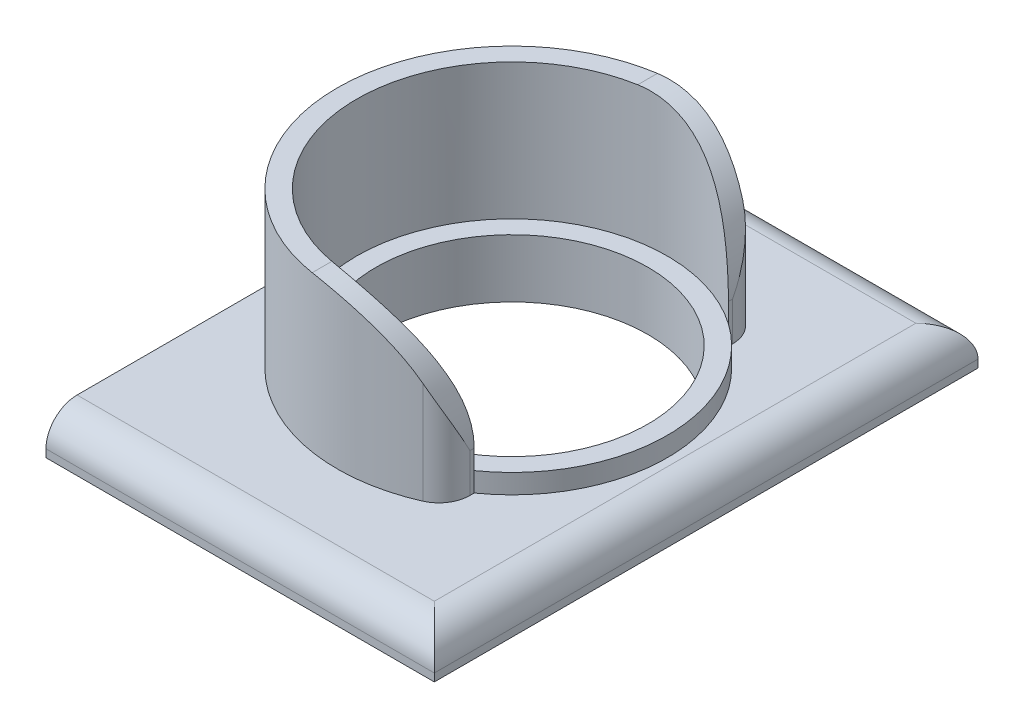
ISO-10303-21;
HEADER;
FILE_DESCRIPTION(('STEP AP214'),'2;1');
FILE_NAME('part.step','',(''),(''),'','','');
FILE_SCHEMA(('AUTOMOTIVE_DESIGN { 1 0 10303 214 1 1 1 1 }'));
ENDSEC;
DATA;
#1=APPLICATION_CONTEXT('core data for automotive mechanical design processes');
#2=APPLICATION_PROTOCOL_DEFINITION('international standard','automotive_design',2000,#1);
#3=PRODUCT_CONTEXT('',#1,'mechanical');
#4=PRODUCT('Part','Part','',(#3));
#5=PRODUCT_RELATED_PRODUCT_CATEGORY('part','',(#4));
#6=PRODUCT_DEFINITION_FORMATION('','',#4);
#7=PRODUCT_DEFINITION_CONTEXT('part definition',#1,'design');
#8=PRODUCT_DEFINITION('design','',#6,#7);
#9=PRODUCT_DEFINITION_SHAPE('','',#8);
#10=(LENGTH_UNIT() NAMED_UNIT(*) SI_UNIT(.MILLI.,.METRE.));
#11=(NAMED_UNIT(*) PLANE_ANGLE_UNIT() SI_UNIT($,.RADIAN.));
#12=(NAMED_UNIT(*) SI_UNIT($,.STERADIAN.) SOLID_ANGLE_UNIT());
#13=UNCERTAINTY_MEASURE_WITH_UNIT(LENGTH_MEASURE(1.E-05),#10,'distance_accuracy_value','');
#14=(GEOMETRIC_REPRESENTATION_CONTEXT(3) GLOBAL_UNCERTAINTY_ASSIGNED_CONTEXT((#13)) GLOBAL_UNIT_ASSIGNED_CONTEXT((#10,
#11,#12)) REPRESENTATION_CONTEXT('',''));
#15=CARTESIAN_POINT('',(0.,0.,0.));
#16=DIRECTION('',(0.,0.,1.));
#17=DIRECTION('',(1.,0.,0.));
#18=AXIS2_PLACEMENT_3D('',#15,#16,#17);
#19=CARTESIAN_POINT('',(-107.,20.,33.8230690505755));
#20=DIRECTION('',(0.,0.,1.));
#21=DIRECTION('',(1.,0.,0.));
#22=AXIS2_PLACEMENT_3D('',#19,#20,#21);
#23=CYLINDRICAL_SURFACE('',#22,30.);
#24=DIRECTION('',(0.,0.,-1.));
#25=VECTOR('',#24,1.);
#26=CARTESIAN_POINT('',(-107.,50.,33.8230690505755));
#27=LINE('',#26,#25);
#28=CARTESIAN_POINT('',(-107.,50.,44.4522215417857));
#29=VERTEX_POINT('',#28);
#30=CARTESIAN_POINT('',(-107.,50.,39.3827373350304));
#31=VERTEX_POINT('',#30);
#32=EDGE_CURVE('E255',#29,#31,#27,.T.);
#33=ORIENTED_EDGE('',*,*,#32,.F.);
#34=CARTESIAN_POINT('',(-81.7567567567568,36.2104494250608,41.1361650615108));
#35=CARTESIAN_POINT('',(-82.2080808379939,36.9132292250126,41.3363416194582));
#36=CARTESIAN_POINT('',(-82.6882150526422,37.5963835001399,41.5403678087963));
#37=CARTESIAN_POINT('',(-83.7037382903552,38.9203783184472,41.9491476986305));
#38=CARTESIAN_POINT('',(-84.2391416949642,39.5612077768329,42.1539015750265));
#39=CARTESIAN_POINT('',(-85.3663889202885,40.8012886558936,42.5584130455353));
#40=CARTESIAN_POINT('',(-85.9585890978726,41.4002304531987,42.7581276205865));
#41=CARTESIAN_POINT('',(-87.1936275992789,42.548132420231,43.1441222436832));
#42=CARTESIAN_POINT('',(-87.8364623069383,43.0970961532125,43.3304032492963));
#43=CARTESIAN_POINT('',(-89.1715727017559,44.1426596793003,43.6832137835042));
#44=CARTESIAN_POINT('',(-89.8639806843488,44.6391098784022,43.8496870459985));
#45=CARTESIAN_POINT('',(-91.2928576151953,45.573704517047,44.155626754506));
#46=CARTESIAN_POINT('',(-92.029327713164,46.0118474342122,44.2950924954079));
#47=CARTESIAN_POINT('',(-93.5388883908482,46.8240652937441,44.5402812089265));
#48=CARTESIAN_POINT('',(-94.3118438123261,47.1983561313643,44.6461189747726));
#49=CARTESIAN_POINT('',(-95.890711782247,47.8805113211543,44.8190143634826));
#50=CARTESIAN_POINT('',(-96.6966197857024,48.1883847974281,44.8860773151769));
#51=CARTESIAN_POINT('',(-98.2616596615149,48.7099340822624,44.9726245166167));
#52=CARTESIAN_POINT('',(-99.0186157210302,48.9295364610423,44.9957955038477));
#53=CARTESIAN_POINT('',(-100.547678617193,49.3084935612857,45.0031594868486));
#54=CARTESIAN_POINT('',(-101.31978483423,49.4678507412744,44.9873540733908));
#55=CARTESIAN_POINT('',(-102.873439568846,49.7252836061115,44.9149088040711));
#56=CARTESIAN_POINT('',(-103.655000404069,49.8232679495248,44.8582083525053));
#57=CARTESIAN_POINT('',(-105.219230080149,49.9573851657896,44.7032120992976));
#58=CARTESIAN_POINT('',(-106.001898790331,49.9935248090914,44.6049208522788));
#59=CARTESIAN_POINT('',(-107.484306289203,50.0043243019194,44.3789444143862));
#60=CARTESIAN_POINT('',(-108.184603721266,49.984701682258,44.2551193082252));
#61=CARTESIAN_POINT('',(-109.575676809992,49.8973514751151,43.9751047391845));
#62=CARTESIAN_POINT('',(-110.266451809571,49.829620584748,43.8189130546906));
#63=CARTESIAN_POINT('',(-111.633444943159,49.648035992749,43.4759580600407));
#64=CARTESIAN_POINT('',(-112.309677719686,49.5342312163978,43.2892273039187));
#65=CARTESIAN_POINT('',(-113.310607267186,49.3307389405995,42.987780757231));
#66=CARTESIAN_POINT('',(-113.641988811151,49.2574509116839,42.8837490177364));
#67=CARTESIAN_POINT('',(-114.2999583146,49.1002573225201,42.6688522917683));
#68=CARTESIAN_POINT('',(-114.626546611072,49.0163525127117,42.5579877885478));
#69=CARTESIAN_POINT('',(-114.950592277062,48.9272895799783,42.4438427874415));
#70=B_SPLINE_CURVE_WITH_KNOTS('',3,(#34,#35,#36,#37,#38,#39,#40,#41,#42,#43,#44,#45,#46,#47,#48,
#49,#50,#51,#52,#53,#54,#55,#56,#57,#58,#59,#60,#61,#62,#63,#64,#65,#66,#67,#68,#69),
.UNSPECIFIED.,.F.,.F.,(4,2,2,2,2,2,2,2,2,2,2,2,2,2,2,2,2,4),(0.,2.57588542593034,
5.15244281826887,7.74638037037042,10.3401328390783,12.941085625306,15.5421063079554,
18.1341502422074,20.7258378666131,23.0880685072971,25.4502027381299,27.8158442408992,
30.1812267484206,32.3130791313033,34.4450778912025,36.5748186218111,37.6395248004145,
38.7041557629998),.UNSPECIFIED.);
#71=CARTESIAN_POINT('',(-81.7567567567568,36.2104494250608,41.1361650615108));
#72=VERTEX_POINT('',#71);
#73=EDGE_CURVE('E221',#72,#29,#70,.T.);
#74=ORIENTED_EDGE('',*,*,#73,.F.);
#75=CARTESIAN_POINT('',(-77.,20.,33.8230690505755));
#76=CARTESIAN_POINT('',(-77.0000000027211,20.0102597284702,33.8283671506041));
#77=CARTESIAN_POINT('',(-77.0000052657517,20.0205195136878,33.8336652809302));
#78=CARTESIAN_POINT('',(-77.0009599545156,20.9512688374859,34.31430172969));
#79=CARTESIAN_POINT('',(-77.0442489036348,21.8721929880222,34.7898256869572));
#80=CARTESIAN_POINT('',(-77.2161500829284,23.7117189210807,35.7311968199383));
#81=CARTESIAN_POINT('',(-77.3448342595194,24.6303180891356,36.1970354940916));
#82=CARTESIAN_POINT('',(-77.6893793896831,26.4618431068924,37.1081872413296));
#83=CARTESIAN_POINT('',(-77.9052438215703,27.3747687287555,37.5534994946621));
#84=CARTESIAN_POINT('',(-78.2963157233976,28.7362062709723,38.1961004096242));
#85=CARTESIAN_POINT('',(-78.4378591543954,29.1886260167473,38.4060430585676));
#86=CARTESIAN_POINT('',(-78.7438266974139,30.0903567720104,38.8156275290006));
#87=CARTESIAN_POINT('',(-78.9082475066704,30.5396682204263,39.0152708316949));
#88=CARTESIAN_POINT('',(-79.2835963662446,31.4933460023048,39.4275628949265));
#89=CARTESIAN_POINT('',(-79.4977968795111,31.9971830947641,39.6384699965283));
#90=CARTESIAN_POINT('',(-79.956689919894,32.9985563393301,40.0406291434315));
#91=CARTESIAN_POINT('',(-80.2013665828317,33.49609562236,40.2318913209534));
#92=CARTESIAN_POINT('',(-80.5919422629483,34.2370168797612,40.5009477912704));
#93=CARTESIAN_POINT('',(-80.7262024394469,34.4833286507205,40.5877358745401));
#94=CARTESIAN_POINT('',(-81.0025945942487,34.9737815343758,40.7546499423415));
#95=CARTESIAN_POINT('',(-81.1447261095024,35.2179227737799,40.8347763180713));
#96=CARTESIAN_POINT('',(-81.4370928409925,35.7040865024024,40.9877714128147));
#97=CARTESIAN_POINT('',(-81.5873383424262,35.9461058279971,41.0606305705461));
#98=CARTESIAN_POINT('',(-81.8957966090314,36.4274380880269,41.1981893489625));
#99=CARTESIAN_POINT('',(-82.0540109785691,36.666750465502,41.2628873172987));
#100=CARTESIAN_POINT('',(-82.2161957768516,36.9045274476589,41.3230979869985));
#101=B_SPLINE_CURVE_WITH_KNOTS('',3,(#75,#76,#77,#78,#79,#80,#81,#82,#83,#84,#85,#86,#87,#88,
#89,#90,#91,#92,#93,#94,#95,#96,#97,#98,#99,#100),.UNSPECIFIED.,.F.,.F.,(4,2,2,2,2,2,2,2,2,2,2,
2,4),(0.,0.0346410197498268,3.14255467573778,6.25309011313507,9.36374966681858,10.9186106091243,
12.4732473115241,14.2323027896098,15.9904463988374,16.8712261457678,17.7519541337261,
18.6338259963175,19.5158761207878),.UNSPECIFIED.);
#102=CARTESIAN_POINT('',(-77.,20.,33.8230690505755));
#103=VERTEX_POINT('',#102);
#104=EDGE_CURVE('E229',#103,#72,#101,.T.);
#105=ORIENTED_EDGE('',*,*,#104,.F.);
#106=DIRECTION('',(0.,0.,-1.));
#107=VECTOR('',#106,1.);
#108=CARTESIAN_POINT('',(-77.,20.,33.8230690505755));
#109=LINE('',#108,#107);
#110=CARTESIAN_POINT('',(-77.,20.,32.7261363439071));
#111=VERTEX_POINT('',#110);
#112=EDGE_CURVE('E254',#111,#103,#109,.F.);
#113=ORIENTED_EDGE('',*,*,#112,.F.);
#114=CARTESIAN_POINT('',(-77.,20.,32.7261363439071));
#115=CARTESIAN_POINT('',(-76.9999889549258,20.386959075707,32.7261125566604));
#116=CARTESIAN_POINT('',(-77.0074866220145,20.7739089315374,32.7313975567596));
#117=CARTESIAN_POINT('',(-77.03741556169,21.5469197704808,32.75240948549));
#118=CARTESIAN_POINT('',(-77.0598457604845,21.9329808155049,32.7681356633002));
#119=CARTESIAN_POINT('',(-77.1195268566323,22.7030238876672,32.8098340091964));
#120=CARTESIAN_POINT('',(-77.1567632816497,23.0870075749228,32.8357961719169));
#121=CARTESIAN_POINT('',(-77.2458875139034,23.8524425333169,32.8976180520637));
#122=CARTESIAN_POINT('',(-77.2977754844878,24.233893776173,32.9334778798376));
#123=CARTESIAN_POINT('',(-77.4741890951267,25.367273608837,33.054628222278));
#124=CARTESIAN_POINT('',(-77.6199604937767,26.114553063103,33.1538450225408));
#125=CARTESIAN_POINT('',(-77.9663730603894,27.591050628555,33.3850626385745));
#126=CARTESIAN_POINT('',(-78.1670257581624,28.3202649093486,33.5170703427302));
#127=CARTESIAN_POINT('',(-78.6199828616259,29.7538498773841,33.8077941394443));
#128=CARTESIAN_POINT('',(-78.872092582104,30.458302805442,33.9664091729113));
#129=CARTESIAN_POINT('',(-79.4260549037415,31.8420027191063,34.3047816543356));
#130=CARTESIAN_POINT('',(-79.7279058039523,32.5212505656524,34.4845383792718));
#131=CARTESIAN_POINT('',(-80.3799750655116,33.8537280857741,34.8596670877113));
#132=CARTESIAN_POINT('',(-80.7303075279767,34.5068915543394,35.0550754363026));
#133=CARTESIAN_POINT('',(-81.476878946182,35.7834446453141,35.4552305182296));
#134=CARTESIAN_POINT('',(-81.8731211050655,36.4068321859512,35.6599779025497));
#135=CARTESIAN_POINT('',(-82.7591204992677,37.6934899498518,36.0974235951098));
#136=CARTESIAN_POINT('',(-83.2543952085359,38.3528151122656,36.3305746798826));
#137=CARTESIAN_POINT('',(-84.2981315044282,39.6291835878489,36.793713195605));
#138=CARTESIAN_POINT('',(-84.8465965636963,40.246224135884,37.0237004188744));
#139=CARTESIAN_POINT('',(-85.9946162198047,41.4349357090609,37.4730453360358));
#140=CARTESIAN_POINT('',(-86.5941657840403,42.006611192663,37.6924040736638));
#141=CARTESIAN_POINT('',(-87.8421526894268,43.1012052482461,38.113256577842));
#142=CARTESIAN_POINT('',(-88.4905901246537,43.6241237263985,38.3147503100124));
#143=CARTESIAN_POINT('',(-89.8639688883532,44.63977549592,38.7013251759046));
#144=CARTESIAN_POINT('',(-90.5910447048889,45.1300704444584,38.8852502841043));
#145=CARTESIAN_POINT('',(-92.0916021485331,46.0482784133476,39.217946064837));
#146=CARTESIAN_POINT('',(-92.8650870190576,46.4761870664868,39.3667142767433));
#147=CARTESIAN_POINT('',(-94.0546992510447,47.0668633268007,39.5577388115549));
#148=CARTESIAN_POINT('',(-94.4558295156411,47.2551050696201,39.6160280539255));
#149=CARTESIAN_POINT('',(-95.2672793957283,47.6141263730012,39.7211354294445));
#150=CARTESIAN_POINT('',(-95.6775976714817,47.7849084594661,39.7679552232598));
#151=CARTESIAN_POINT('',(-96.5064301436458,48.1084127661798,39.8493204072289));
#152=CARTESIAN_POINT('',(-96.9249432177692,48.2611374395265,39.8838674659137));
#153=CARTESIAN_POINT('',(-97.7690923254906,48.54801443222,39.9399807323197));
#154=CARTESIAN_POINT('',(-98.1947279463382,48.6821678236208,39.9615476895768));
#155=CARTESIAN_POINT('',(-99.351541825778,49.0185396987316,40.0013721209408));
#156=CARTESIAN_POINT('',(-100.088494703587,49.2028568523998,40.0067978602399));
#157=CARTESIAN_POINT('',(-101.573399284926,49.5148673889734,39.9759384549214));
#158=CARTESIAN_POINT('',(-102.321349601519,49.6425678498479,39.939658526201));
#159=CARTESIAN_POINT('',(-103.448866110984,49.7915225554283,39.8528432243256));
#160=CARTESIAN_POINT('',(-103.827009355448,49.834150513081,39.8183219722157));
#161=CARTESIAN_POINT('',(-104.583527788169,49.9049313762118,39.7383425189134));
#162=CARTESIAN_POINT('',(-104.96190297879,49.9330841315348,39.6928842042753));
#163=CARTESIAN_POINT('',(-105.718117984305,49.9749932815168,39.591018022106));
#164=CARTESIAN_POINT('',(-106.095957530402,49.9887440148541,39.5346058590242));
#165=CARTESIAN_POINT('',(-106.850103266492,50.0019987055914,39.4109418927887));
#166=CARTESIAN_POINT('',(-107.226409485034,50.0015029294776,39.3436902924141));
#167=CARTESIAN_POINT('',(-107.601531682741,49.9939687209722,39.2710671624326));
#168=B_SPLINE_CURVE_WITH_KNOTS('',3,(#114,#115,#116,#117,#118,#119,#120,#121,#122,#123,#124,
#125,#126,#127,#128,#129,#130,#131,#132,#133,#134,#135,#136,#137,#138,#139,#140,#141,#142,#143,
#144,#145,#146,#147,#148,#149,#150,#151,#152,#153,#154,#155,#156,#157,#158,#159,#160,#161,#162,
#163,#164,#165,#166,#167),.UNSPECIFIED.,.F.,.F.,(4,2,2,2,2,2,2,2,2,2,2,2,2,2,2,2,2,2,2,2,2,2,2,
2,2,2,4),(0.,1.16075251767294,2.32142157511961,3.48095891526601,4.64050918343661,
6.94061878404182,9.24121197787447,11.5332571751361,13.8252240099154,16.1226797375213,
18.4202958564435,20.9884119925289,23.5566959065023,26.1247270971439,28.6927632296314,
31.3770611302825,34.0615468490043,35.401827147645,36.7419132716139,38.0818171353359,
39.4216436189007,41.6972384793214,43.9725487746455,45.1184912698341,46.2644456519386,
47.4108503308407,48.5572335658419),.UNSPECIFIED.);
#169=EDGE_CURVE('E246',#31,#111,#168,.F.);
#170=ORIENTED_EDGE('',*,*,#169,.F.);
#171=EDGE_LOOP('',(#33,#74,#105,#113,#170));
#172=FACE_BOUND('',#171,.T.);
#173=ADVANCED_FACE('F35',(#172),#23,.T.);
#174=CARTESIAN_POINT('',(-107.,20.,33.8230690505755));
#175=DIRECTION('',(0.,0.,1.));
#176=DIRECTION('',(1.,0.,0.));
#177=AXIS2_PLACEMENT_3D('',#174,#175,#176);
#178=CYLINDRICAL_SURFACE('',#177,30.);
#179=DIRECTION('',(0.,0.,-1.));
#180=VECTOR('',#179,1.);
#181=CARTESIAN_POINT('',(-107.,50.,33.8230690505755));
#182=LINE('',#181,#180);
#183=CARTESIAN_POINT('',(-107.,50.,-39.3827373350304));
#184=VERTEX_POINT('',#183);
#185=CARTESIAN_POINT('',(-107.,50.,-44.4522215417858));
#186=VERTEX_POINT('',#185);
#187=EDGE_CURVE('E186',#184,#186,#182,.T.);
#188=ORIENTED_EDGE('',*,*,#187,.F.);
#189=CARTESIAN_POINT('',(-77.,20.,-32.7261363439071));
#190=CARTESIAN_POINT('',(-76.9999889549258,20.386959075707,-32.7261125566604));
#191=CARTESIAN_POINT('',(-77.0074866220145,20.7739089315374,-32.7313975567596));
#192=CARTESIAN_POINT('',(-77.03741556169,21.5469197704808,-32.75240948549));
#193=CARTESIAN_POINT('',(-77.0598457604845,21.9329808155049,-32.7681356633002));
#194=CARTESIAN_POINT('',(-77.1195268566323,22.7030238876672,-32.8098340091964));
#195=CARTESIAN_POINT('',(-77.1567632816497,23.0870075749228,-32.8357961719169));
#196=CARTESIAN_POINT('',(-77.2458875139034,23.8524425333169,-32.8976180520637));
#197=CARTESIAN_POINT('',(-77.2977754844878,24.233893776173,-32.9334778798376));
#198=CARTESIAN_POINT('',(-77.4741890951267,25.367273608837,-33.054628222278));
#199=CARTESIAN_POINT('',(-77.6199604937767,26.114553063103,-33.1538450225408));
#200=CARTESIAN_POINT('',(-77.9663730603894,27.591050628555,-33.3850626385745));
#201=CARTESIAN_POINT('',(-78.1670257581624,28.3202649093486,-33.5170703427302));
#202=CARTESIAN_POINT('',(-78.6199828616259,29.7538498773841,-33.8077941394443));
#203=CARTESIAN_POINT('',(-78.872092582104,30.458302805442,-33.9664091729113));
#204=CARTESIAN_POINT('',(-79.4260549037415,31.8420027191063,-34.3047816543356));
#205=CARTESIAN_POINT('',(-79.7279058039523,32.5212505656524,-34.4845383792718));
#206=CARTESIAN_POINT('',(-80.3799750655116,33.8537280857741,-34.8596670877113));
#207=CARTESIAN_POINT('',(-80.7303075279767,34.5068915543394,-35.0550754363026));
#208=CARTESIAN_POINT('',(-81.476878946182,35.7834446453141,-35.4552305182296));
#209=CARTESIAN_POINT('',(-81.8731211050655,36.4068321859512,-35.6599779025497));
#210=CARTESIAN_POINT('',(-82.7591204992677,37.6934899498518,-36.0974235951098));
#211=CARTESIAN_POINT('',(-83.2543952085359,38.3528151122656,-36.3305746798826));
#212=CARTESIAN_POINT('',(-84.2981315044282,39.6291835878489,-36.793713195605));
#213=CARTESIAN_POINT('',(-84.8465965636963,40.246224135884,-37.0237004188744));
#214=CARTESIAN_POINT('',(-85.9946162198047,41.4349357090609,-37.4730453360358));
#215=CARTESIAN_POINT('',(-86.5941657840403,42.006611192663,-37.6924040736638));
#216=CARTESIAN_POINT('',(-87.8421526894268,43.1012052482461,-38.113256577842));
#217=CARTESIAN_POINT('',(-88.4905901246537,43.6241237263985,-38.3147503100124));
#218=CARTESIAN_POINT('',(-89.8639688883532,44.63977549592,-38.7013251759046));
#219=CARTESIAN_POINT('',(-90.5910447048889,45.1300704444584,-38.8852502841043));
#220=CARTESIAN_POINT('',(-92.0916021485331,46.0482784133476,-39.217946064837));
#221=CARTESIAN_POINT('',(-92.8650870190576,46.4761870664868,-39.3667142767433));
#222=CARTESIAN_POINT('',(-94.0546992510447,47.0668633268007,-39.5577388115549));
#223=CARTESIAN_POINT('',(-94.4558295156411,47.2551050696201,-39.6160280539255));
#224=CARTESIAN_POINT('',(-95.2672793957283,47.6141263730012,-39.7211354294445));
#225=CARTESIAN_POINT('',(-95.6775976714817,47.7849084594661,-39.7679552232598));
#226=CARTESIAN_POINT('',(-96.5064301436458,48.1084127661798,-39.8493204072289));
#227=CARTESIAN_POINT('',(-96.9249432177692,48.2611374395265,-39.8838674659137));
#228=CARTESIAN_POINT('',(-97.7690923254906,48.54801443222,-39.9399807323197));
#229=CARTESIAN_POINT('',(-98.1947279463382,48.6821678236208,-39.9615476895768));
#230=CARTESIAN_POINT('',(-99.351541825778,49.0185396987316,-40.0013721209408));
#231=CARTESIAN_POINT('',(-100.088494703587,49.2028568523998,-40.0067978602399));
#232=CARTESIAN_POINT('',(-101.573399284926,49.5148673889734,-39.9759384549214));
#233=CARTESIAN_POINT('',(-102.321349601519,49.6425678498479,-39.939658526201));
#234=CARTESIAN_POINT('',(-103.448866110984,49.7915225554283,-39.8528432243256));
#235=CARTESIAN_POINT('',(-103.827009355448,49.834150513081,-39.8183219722157));
#236=CARTESIAN_POINT('',(-104.583527788169,49.9049313762118,-39.7383425189134));
#237=CARTESIAN_POINT('',(-104.96190297879,49.9330841315348,-39.6928842042753));
#238=CARTESIAN_POINT('',(-105.718117984305,49.9749932815168,-39.591018022106));
#239=CARTESIAN_POINT('',(-106.095957530402,49.9887440148541,-39.5346058590242));
#240=CARTESIAN_POINT('',(-106.850103266492,50.0019987055914,-39.4109418927887));
#241=CARTESIAN_POINT('',(-107.226409485034,50.0015029294776,-39.3436902924141));
#242=CARTESIAN_POINT('',(-107.601531682741,49.9939687209722,-39.2710671624326));
#243=B_SPLINE_CURVE_WITH_KNOTS('',3,(#189,#190,#191,#192,#193,#194,#195,#196,#197,#198,#199,
#200,#201,#202,#203,#204,#205,#206,#207,#208,#209,#210,#211,#212,#213,#214,#215,#216,#217,#218,
#219,#220,#221,#222,#223,#224,#225,#226,#227,#228,#229,#230,#231,#232,#233,#234,#235,#236,#237,
#238,#239,#240,#241,#242),.UNSPECIFIED.,.F.,.F.,(4,2,2,2,2,2,2,2,2,2,2,2,2,2,2,2,2,2,2,2,2,2,2,
2,2,2,4),(0.,1.16075251767294,2.32142157511961,3.48095891526601,4.64050918343661,
6.94061878404182,9.24121197787447,11.5332571751361,13.8252240099154,16.1226797375213,
18.4202958564435,20.9884119925289,23.5566959065023,26.1247270971439,28.6927632296314,
31.3770611302825,34.0615468490043,35.401827147645,36.7419132716139,38.0818171353359,
39.4216436189007,41.6972384793214,43.9725487746455,45.1184912698341,46.2644456519386,
47.4108503308407,48.5572335658419),.UNSPECIFIED.);
#244=CARTESIAN_POINT('',(-77.,20.,-32.7261363439071));
#245=VERTEX_POINT('',#244);
#246=EDGE_CURVE('E265',#245,#184,#243,.T.);
#247=ORIENTED_EDGE('',*,*,#246,.F.);
#248=DIRECTION('',(0.,0.,-1.));
#249=VECTOR('',#248,1.);
#250=CARTESIAN_POINT('',(-77.,20.,33.8230690505755));
#251=LINE('',#250,#249);
#252=CARTESIAN_POINT('',(-77.,20.,-33.8230690505755));
#253=VERTEX_POINT('',#252);
#254=EDGE_CURVE('E271',#253,#245,#251,.F.);
#255=ORIENTED_EDGE('',*,*,#254,.F.);
#256=CARTESIAN_POINT('',(-81.7567567567567,36.2104494250608,-41.1361650615108));
#257=CARTESIAN_POINT('',(-81.5781933129891,35.932388921913,-41.056955411345));
#258=CARTESIAN_POINT('',(-81.4049530552893,35.6525089055572,-40.9723197849342));
#259=CARTESIAN_POINT('',(-81.0691023548505,35.0895963272145,-40.7933139872259));
#260=CARTESIAN_POINT('',(-80.9064892943121,34.8065645618569,-40.6989462281246));
#261=CARTESIAN_POINT('',(-80.5919954307568,34.238071672771,-40.5016833106967));
#262=CARTESIAN_POINT('',(-80.4401007743405,33.952614239752,-40.3987995475434));
#263=CARTESIAN_POINT('',(-80.1467037699464,33.3792453971698,-40.1853349716711));
#264=CARTESIAN_POINT('',(-80.0052021324783,33.0913338213301,-40.0747536337187));
#265=CARTESIAN_POINT('',(-79.5970265404279,32.2263115809868,-39.73352117407));
#266=CARTESIAN_POINT('',(-79.3455965208838,31.6459438046107,-39.4926873575753));
#267=CARTESIAN_POINT('',(-78.8824892345372,30.4785580349994,-38.9895955854105));
#268=CARTESIAN_POINT('',(-78.6708276054157,29.8915375215851,-38.7273292599985));
#269=CARTESIAN_POINT('',(-78.2681046751026,28.6567235289215,-38.1605346466866));
#270=CARTESIAN_POINT('',(-78.0808871921455,28.0084349588,-37.8543555416163));
#271=CARTESIAN_POINT('',(-77.7517724673917,26.7075603428454,-37.2272696104634));
#272=CARTESIAN_POINT('',(-77.6098759187945,26.0549742314358,-36.9063625591977));
#273=CARTESIAN_POINT('',(-77.3704668816113,24.7468804260594,-36.2542925295843));
#274=CARTESIAN_POINT('',(-77.2729525840615,24.0913728522674,-35.9231299698257));
#275=CARTESIAN_POINT('',(-77.1216602378794,22.7786940630281,-35.2545645934942));
#276=CARTESIAN_POINT('',(-77.0678693772944,22.1215233915651,-34.917163634572));
#277=CARTESIAN_POINT('',(-77.0240760983692,21.2252191267239,-34.4554530300686));
#278=CARTESIAN_POINT('',(-77.0152655639961,20.9863186210824,-34.332240341795));
#279=CARTESIAN_POINT('',(-77.003358908945,20.5085358502566,-34.0856725144315));
#280=CARTESIAN_POINT('',(-77.0002608652103,20.2696536060145,-33.9623174372735));
#281=CARTESIAN_POINT('',(-77.0000052633228,20.0205195528302,-33.8336653019691));
#282=CARTESIAN_POINT('',(-77.0000000001974,20.0102597674963,-33.8283671715973));
#283=CARTESIAN_POINT('',(-77.,20.,-33.8230690505755));
#284=B_SPLINE_CURVE_WITH_KNOTS('',3,(#256,#257,#258,#259,#260,#261,#262,#263,#264,#265,#266,
#267,#268,#269,#270,#271,#272,#273,#274,#275,#276,#277,#278,#279,#280,#281,#282,#283),
.UNSPECIFIED.,.F.,.F.,(4,2,2,2,2,2,2,2,2,2,2,2,2,4),(0.,1.01930182209956,2.03835160555392,
3.0560591949341,4.07383629437762,6.10234766449599,8.13165502176952,10.3529627411298,
12.5743044345382,14.7955555807809,17.0161556154899,17.8229583559242,18.6294894441185,
18.6641304638683),.UNSPECIFIED.);
#285=CARTESIAN_POINT('',(-81.7567567567567,36.2104494250608,-41.1361650615108));
#286=VERTEX_POINT('',#285);
#287=EDGE_CURVE('E198',#286,#253,#284,.T.);
#288=ORIENTED_EDGE('',*,*,#287,.F.);
#289=CARTESIAN_POINT('',(-107.,50.,-44.4522215417858));
#290=CARTESIAN_POINT('',(-106.638464912638,50.000007933049,-44.5091622622156));
#291=CARTESIAN_POINT('',(-106.276233340198,49.9934646078557,-44.561674942791));
#292=CARTESIAN_POINT('',(-105.55107251881,49.9671841559139,-44.65780071203));
#293=CARTESIAN_POINT('',(-105.188143276261,49.9474471495783,-44.7014138819108));
#294=CARTESIAN_POINT('',(-104.462353585424,49.8946937086964,-44.7796897676333));
#295=CARTESIAN_POINT('',(-104.099493139067,49.8616801217435,-44.8143544001632));
#296=CARTESIAN_POINT('',(-103.374515846783,49.7823593229934,-44.8747708585988));
#297=CARTESIAN_POINT('',(-103.012399009498,49.7360519575634,-44.9005225814928));
#298=CARTESIAN_POINT('',(-101.931604294189,49.5776831772089,-44.964290462188));
#299=CARTESIAN_POINT('',(-101.214840109322,49.4459109878269,-44.9892093176299));
#300=CARTESIAN_POINT('',(-100.148404326483,49.209390693786,-45.0011635758042));
#301=CARTESIAN_POINT('',(-99.7943577482512,49.1240676825934,-45.0009102592353));
#302=CARTESIAN_POINT('',(-99.0896072430711,48.9405987299759,-44.9921698405249));
#303=CARTESIAN_POINT('',(-98.7389040851023,48.842449911511,-44.9836808882417));
#304=CARTESIAN_POINT('',(-97.6932914251439,48.5291820003466,-44.9462465875878));
#305=CARTESIAN_POINT('',(-97.0043679265594,48.2951280520674,-44.9053387942106));
#306=CARTESIAN_POINT('',(-95.6473943569286,47.7785087696882,-44.7941784982726));
#307=CARTESIAN_POINT('',(-94.9793459430274,47.4959395957672,-44.7239236723595));
#308=CARTESIAN_POINT('',(-93.9957952785651,47.0374146263333,-44.598868127396));
#309=CARTESIAN_POINT('',(-93.6708691785016,46.8787035776327,-44.5538757594632));
#310=CARTESIAN_POINT('',(-93.027763397453,46.5500839510923,-44.4577730549674));
#311=CARTESIAN_POINT('',(-92.7095819374228,46.3801783758772,-44.4066643559643));
#312=CARTESIAN_POINT('',(-91.7655752523328,45.8540370617483,-44.244793442758));
#313=CARTESIAN_POINT('',(-91.15026450394,45.4813658936748,-44.1254834060038));
#314=CARTESIAN_POINT('',(-89.9239806399205,44.677339348819,-43.8621098694517));
#315=CARTESIAN_POINT('',(-89.3144315883054,44.2441051083928,-43.7171781098562));
#316=CARTESIAN_POINT('',(-88.1318695732429,43.3355870010333,-43.4110645483371));
#317=CARTESIAN_POINT('',(-87.558857204227,42.8603024502652,-43.24988248214));
#318=CARTESIAN_POINT('',(-86.4512457904875,41.8700914419095,-42.9158024151209));
#319=CARTESIAN_POINT('',(-85.9166692590994,41.3551421110436,-42.7428976612282));
#320=CARTESIAN_POINT('',(-84.8881501154985,40.288301199365,-42.3901830316513));
#321=CARTESIAN_POINT('',(-84.3942111861267,39.7364062785074,-42.2103725322852));
#322=CARTESIAN_POINT('',(-83.3864399619303,38.5229888157209,-41.8248463130959));
#323=CARTESIAN_POINT('',(-82.8785641624171,37.8566038380366,-41.6188394481708));
#324=CARTESIAN_POINT('',(-81.9196488130768,36.4826470795377,-41.2113132155739));
#325=CARTESIAN_POINT('',(-81.4686118738924,35.7750734090826,-41.0097940543747));
#326=CARTESIAN_POINT('',(-80.8369056400967,34.6856649274128,-40.7164553655944));
#327=CARTESIAN_POINT('',(-80.6338156343853,34.3178622966207,-40.6201677815457));
#328=CARTESIAN_POINT('',(-80.2429396184361,33.5733705118495,-40.4314930309891));
#329=CARTESIAN_POINT('',(-80.0551483738515,33.1966844546251,-40.3391045356983));
#330=CARTESIAN_POINT('',(-79.6951224915312,32.4346808784817,-40.1590898826702));
#331=CARTESIAN_POINT('',(-79.5228928553185,32.0493606338309,-40.0714652596267));
#332=CARTESIAN_POINT('',(-79.1943729497809,31.2705728992621,-39.9018794080236));
#333=CARTESIAN_POINT('',(-79.0380891645953,30.8771021726947,-39.8199204876703));
#334=CARTESIAN_POINT('',(-78.8900058523545,30.4798964221666,-39.7412650413443));
#335=B_SPLINE_CURVE_WITH_KNOTS('',3,(#289,#290,#291,#292,#293,#294,#295,#296,#297,#298,#299,
#300,#301,#302,#303,#304,#305,#306,#307,#308,#309,#310,#311,#312,#313,#314,#315,#316,#317,#318,
#319,#320,#321,#322,#323,#324,#325,#326,#327,#328,#329,#330,#331,#332,#333,#334),.UNSPECIFIED.,
.F.,.F.,(4,2,2,2,2,2,2,2,2,2,2,2,2,2,2,2,2,2,2,2,2,2,4),(0.,1.09788530094467,2.19576058210314,
3.29340051376605,4.3910531310734,6.57537700117947,7.66766221852116,8.76019287538523,
10.9436896258828,13.1273592727143,14.2203226038981,15.3129939617591,17.4982594938345,
19.7812331090315,22.0642438574673,24.3485811384071,26.6331252131738,29.2187330345365,
31.8044595711496,33.0972673637941,34.389630958684,35.6824084544236,36.975709560878),.UNSPECIFIED.);
#336=EDGE_CURVE('E189',#186,#286,#335,.T.);
#337=ORIENTED_EDGE('',*,*,#336,.F.);
#338=EDGE_LOOP('',(#188,#247,#255,#288,#337));
#339=FACE_BOUND('',#338,.T.);
#340=ADVANCED_FACE('F205',(#339),#178,.T.);
#341=CARTESIAN_POINT('',(-100.,15.,0.));
#342=DIRECTION('',(0.,-1.,0.));
#343=DIRECTION('',(0.,0.,-1.));
#344=AXIS2_PLACEMENT_3D('',#341,#342,#343);
#345=CYLINDRICAL_SURFACE('',#344,40.);
#346=DIRECTION('',(0.,-1.,0.));
#347=VECTOR('',#346,1.);
#348=CARTESIAN_POINT('',(-77.,15.,32.7261363439071));
#349=LINE('',#348,#347);
#350=CARTESIAN_POINT('',(-77.,10.,32.7261363439071));
#351=VERTEX_POINT('',#350);
#352=CARTESIAN_POINT('',(-77.,15.,32.7261363439071));
#353=VERTEX_POINT('',#352);
#354=EDGE_CURVE('E183',#351,#353,#349,.F.);
#355=ORIENTED_EDGE('',*,*,#354,.F.);
#356=CARTESIAN_POINT('',(-100.,10.,0.));
#357=DIRECTION('',(0.,1.,0.));
#358=DIRECTION('',(0.,0.,1.));
#359=AXIS2_PLACEMENT_3D('',#356,#357,#358);
#360=CIRCLE('',#359,40.);
#361=CARTESIAN_POINT('',(-77.,10.,-32.7261363439071));
#362=VERTEX_POINT('',#361);
#363=EDGE_CURVE('E301',#351,#362,#360,.T.);
#364=ORIENTED_EDGE('',*,*,#363,.T.);
#365=DIRECTION('',(0.,-1.,0.));
#366=VECTOR('',#365,1.);
#367=CARTESIAN_POINT('',(-77.,15.,-32.7261363439071));
#368=LINE('',#367,#366);
#369=CARTESIAN_POINT('',(-77.,15.,-32.7261363439071));
#370=VERTEX_POINT('',#369);
#371=EDGE_CURVE('E180',#370,#362,#368,.T.);
#372=ORIENTED_EDGE('',*,*,#371,.F.);
#373=CARTESIAN_POINT('',(-100.,15.,0.));
#374=DIRECTION('',(0.,1.,0.));
#375=DIRECTION('',(0.,0.,1.));
#376=AXIS2_PLACEMENT_3D('',#373,#374,#375);
#377=CIRCLE('',#376,40.);
#378=EDGE_CURVE('E302',#353,#370,#377,.T.);
#379=ORIENTED_EDGE('',*,*,#378,.F.);
#380=EDGE_LOOP('',(#355,#364,#372,#379));
#381=FACE_BOUND('',#380,.T.);
#382=ADVANCED_FACE('F402',(#381),#345,.T.);
#383=CARTESIAN_POINT('',(-150.,10.,70.));
#384=DIRECTION('',(1.,0.,0.));
#385=DIRECTION('',(0.,0.,-1.));
#386=AXIS2_PLACEMENT_3D('',#383,#384,#385);
#387=PLANE('',#386);
#388=CARTESIAN_POINT('',(-150.,5.,-50.));
#389=DIRECTION('',(-1.,0.,0.));
#390=DIRECTION('',(0.,0.,1.));
#391=AXIS2_PLACEMENT_3D('',#388,#389,#390);
#392=CIRCLE('',#391,4.00000000000001);
#393=CARTESIAN_POINT('',(-150.,5.,-46.));
#394=VERTEX_POINT('',#393);
#395=EDGE_CURVE('E435',#394,#394,#392,.T.);
#396=ORIENTED_EDGE('',*,*,#395,.F.);
#397=EDGE_LOOP('',(#396));
#398=FACE_BOUND('',#397,.T.);
#399=CARTESIAN_POINT('',(-150.,5.,50.));
#400=DIRECTION('',(-1.,0.,0.));
#401=DIRECTION('',(0.,0.,1.));
#402=AXIS2_PLACEMENT_3D('',#399,#400,#401);
#403=CIRCLE('',#402,4.00000000000001);
#404=CARTESIAN_POINT('',(-150.,5.,54.));
#405=VERTEX_POINT('',#404);
#406=EDGE_CURVE('E315',#405,#405,#403,.T.);
#407=ORIENTED_EDGE('',*,*,#406,.F.);
#408=EDGE_LOOP('',(#407));
#409=FACE_BOUND('',#408,.T.);
#410=DIRECTION('',(0.,-1.,0.));
#411=VECTOR('',#410,1.);
#412=CARTESIAN_POINT('',(-150.,10.,70.));
#413=LINE('',#412,#411);
#414=CARTESIAN_POINT('',(-150.,2.,70.));
#415=VERTEX_POINT('',#414);
#416=CARTESIAN_POINT('',(-150.,0.,70.));
#417=VERTEX_POINT('',#416);
#418=EDGE_CURVE('E178',#415,#417,#413,.T.);
#419=ORIENTED_EDGE('',*,*,#418,.F.);
#420=CARTESIAN_POINT('',(-150.,2.,62.));
#421=DIRECTION('',(1.,0.,0.));
#422=DIRECTION('',(0.,0.,-1.));
#423=AXIS2_PLACEMENT_3D('',#420,#421,#422);
#424=CIRCLE('',#423,8.);
#425=CARTESIAN_POINT('',(-150.,10.,62.));
#426=VERTEX_POINT('',#425);
#427=EDGE_CURVE('E44',#415,#426,#424,.F.);
#428=ORIENTED_EDGE('',*,*,#427,.T.);
#429=DIRECTION('',(0.,0.,1.));
#430=VECTOR('',#429,1.);
#431=CARTESIAN_POINT('',(-150.,10.,70.));
#432=LINE('',#431,#430);
#433=CARTESIAN_POINT('',(-150.,10.,-62.));
#434=VERTEX_POINT('',#433);
#435=EDGE_CURVE('E168',#434,#426,#432,.T.);
#436=ORIENTED_EDGE('',*,*,#435,.F.);
#437=CARTESIAN_POINT('',(-150.,2.,-62.));
#438=DIRECTION('',(1.,0.,0.));
#439=DIRECTION('',(0.,0.,-1.));
#440=AXIS2_PLACEMENT_3D('',#437,#438,#439);
#441=CIRCLE('',#440,8.);
#442=CARTESIAN_POINT('',(-150.,2.,-70.));
#443=VERTEX_POINT('',#442);
#444=EDGE_CURVE('E52',#434,#443,#441,.F.);
#445=ORIENTED_EDGE('',*,*,#444,.T.);
#446=DIRECTION('',(0.,-1.,0.));
#447=VECTOR('',#446,1.);
#448=CARTESIAN_POINT('',(-150.,10.,-70.));
#449=LINE('',#448,#447);
#450=CARTESIAN_POINT('',(-150.,0.,-70.));
#451=VERTEX_POINT('',#450);
#452=EDGE_CURVE('E172',#443,#451,#449,.T.);
#453=ORIENTED_EDGE('',*,*,#452,.T.);
#454=DIRECTION('',(0.,0.,1.));
#455=VECTOR('',#454,1.);
#456=CARTESIAN_POINT('',(-150.,0.,70.));
#457=LINE('',#456,#455);
#458=EDGE_CURVE('E167',#451,#417,#457,.T.);
#459=ORIENTED_EDGE('',*,*,#458,.T.);
#460=EDGE_LOOP('',(#419,#428,#436,#445,#453,#459));
#461=FACE_BOUND('',#460,.T.);
#462=ADVANCED_FACE('F306',(#398,#409,#461),#387,.F.);
#463=CARTESIAN_POINT('',(150.,10.,70.));
#464=DIRECTION('',(0.,0.,-1.));
#465=DIRECTION('',(-1.,0.,0.));
#466=AXIS2_PLACEMENT_3D('',#463,#464,#465);
#467=PLANE('',#466);
#468=DIRECTION('',(0.,1.,0.));
#469=VECTOR('',#468,1.);
#470=CARTESIAN_POINT('',(-50.,0.,70.));
#471=LINE('',#470,#469);
#472=CARTESIAN_POINT('',(-50.,0.,70.));
#473=VERTEX_POINT('',#472);
#474=CARTESIAN_POINT('',(-50.,2.,70.));
#475=VERTEX_POINT('',#474);
#476=EDGE_CURVE('E151',#473,#475,#471,.T.);
#477=ORIENTED_EDGE('',*,*,#476,.T.);
#478=DIRECTION('',(1.,0.,0.));
#479=VECTOR('',#478,1.);
#480=CARTESIAN_POINT('',(-150.,2.,70.));
#481=LINE('',#480,#479);
#482=EDGE_CURVE('E60',#475,#415,#481,.F.);
#483=ORIENTED_EDGE('',*,*,#482,.T.);
#484=ORIENTED_EDGE('',*,*,#418,.T.);
#485=DIRECTION('',(1.,0.,0.));
#486=VECTOR('',#485,1.);
#487=CARTESIAN_POINT('',(150.,0.,70.));
#488=LINE('',#487,#486);
#489=EDGE_CURVE('E169',#417,#473,#488,.T.);
#490=ORIENTED_EDGE('',*,*,#489,.T.);
#491=EDGE_LOOP('',(#477,#483,#484,#490));
#492=FACE_BOUND('',#491,.T.);
#493=ADVANCED_FACE('F411',(#492),#467,.F.);
#494=CARTESIAN_POINT('',(150.,10.,-70.));
#495=DIRECTION('',(0.,0.,1.));
#496=DIRECTION('',(1.,0.,0.));
#497=AXIS2_PLACEMENT_3D('',#494,#495,#496);
#498=PLANE('',#497);
#499=ORIENTED_EDGE('',*,*,#452,.F.);
#500=DIRECTION('',(-1.,0.,0.));
#501=VECTOR('',#500,1.);
#502=CARTESIAN_POINT('',(-50.,2.,-70.));
#503=LINE('',#502,#501);
#504=CARTESIAN_POINT('',(-50.,2.,-70.));
#505=VERTEX_POINT('',#504);
#506=EDGE_CURVE('E11',#443,#505,#503,.F.);
#507=ORIENTED_EDGE('',*,*,#506,.T.);
#508=DIRECTION('',(0.,1.,0.));
#509=VECTOR('',#508,1.);
#510=CARTESIAN_POINT('',(-50.,0.,-70.));
#511=LINE('',#510,#509);
#512=CARTESIAN_POINT('',(-50.,0.,-70.));
#513=VERTEX_POINT('',#512);
#514=EDGE_CURVE('E149',#513,#505,#511,.T.);
#515=ORIENTED_EDGE('',*,*,#514,.F.);
#516=DIRECTION('',(-1.,0.,0.));
#517=VECTOR('',#516,1.);
#518=CARTESIAN_POINT('',(150.,0.,-70.));
#519=LINE('',#518,#517);
#520=EDGE_CURVE('E161',#513,#451,#519,.T.);
#521=ORIENTED_EDGE('',*,*,#520,.T.);
#522=EDGE_LOOP('',(#499,#507,#515,#521));
#523=FACE_BOUND('',#522,.T.);
#524=ADVANCED_FACE('F160',(#523),#498,.F.);
#525=CARTESIAN_POINT('',(0.,10.,0.));
#526=DIRECTION('',(0.,1.,0.));
#527=DIRECTION('',(0.,0.,1.));
#528=AXIS2_PLACEMENT_3D('',#525,#526,#527);
#529=PLANE('',#528);
#530=ORIENTED_EDGE('',*,*,#435,.T.);
#531=DIRECTION('',(1.,0.,0.));
#532=VECTOR('',#531,1.);
#533=CARTESIAN_POINT('',(-50.,10.,62.));
#534=LINE('',#533,#532);
#535=CARTESIAN_POINT('',(-58.,10.,62.));
#536=VERTEX_POINT('',#535);
#537=EDGE_CURVE('E322',#426,#536,#534,.T.);
#538=ORIENTED_EDGE('',*,*,#537,.T.);
#539=DIRECTION('',(0.,0.,1.));
#540=VECTOR('',#539,1.);
#541=CARTESIAN_POINT('',(-58.,10.,-70.));
#542=LINE('',#541,#540);
#543=CARTESIAN_POINT('',(-58.,10.,-62.));
#544=VERTEX_POINT('',#543);
#545=EDGE_CURVE('E318',#536,#544,#542,.F.);
#546=ORIENTED_EDGE('',*,*,#545,.T.);
#547=DIRECTION('',(-1.,0.,0.));
#548=VECTOR('',#547,1.);
#549=CARTESIAN_POINT('',(-150.,10.,-62.));
#550=LINE('',#549,#548);
#551=EDGE_CURVE('E312',#544,#434,#550,.T.);
#552=ORIENTED_EDGE('',*,*,#551,.T.);
#553=EDGE_LOOP('',(#530,#538,#546,#552));
#554=FACE_BOUND('',#553,.T.);
#555=ORIENTED_EDGE('',*,*,#363,.F.);
#556=DIRECTION('',(0.,0.,-1.));
#557=VECTOR('',#556,1.);
#558=CARTESIAN_POINT('',(-77.,10.,32.7261363439071));
#559=LINE('',#558,#557);
#560=CARTESIAN_POINT('',(-77.,10.,33.8230690505755));
#561=VERTEX_POINT('',#560);
#562=EDGE_CURVE('E380',#561,#351,#559,.T.);
#563=ORIENTED_EDGE('',*,*,#562,.F.);
#564=CARTESIAN_POINT('',(-85.,10.,33.8230690505755));
#565=DIRECTION('',(0.,1.,0.));
#566=DIRECTION('',(0.,0.,1.));
#567=AXIS2_PLACEMENT_3D('',#564,#565,#566);
#568=CIRCLE('',#567,8.00000000000001);
#569=CARTESIAN_POINT('',(-81.7567567567568,10.,41.1361650615108));
#570=VERTEX_POINT('',#569);
#571=EDGE_CURVE('E377',#570,#561,#568,.T.);
#572=ORIENTED_EDGE('',*,*,#571,.F.);
#573=CARTESIAN_POINT('',(-100.,10.,0.));
#574=DIRECTION('',(0.,1.,0.));
#575=DIRECTION('',(0.,0.,1.));
#576=AXIS2_PLACEMENT_3D('',#573,#574,#575);
#577=CIRCLE('',#576,45.);
#578=CARTESIAN_POINT('',(-81.7567567567567,10.,-41.1361650615108));
#579=VERTEX_POINT('',#578);
#580=EDGE_CURVE('E374',#579,#570,#577,.T.);
#581=ORIENTED_EDGE('',*,*,#580,.F.);
#582=CARTESIAN_POINT('',(-85.,10.,-33.8230690505755));
#583=DIRECTION('',(0.,1.,0.));
#584=DIRECTION('',(0.,0.,1.));
#585=AXIS2_PLACEMENT_3D('',#582,#583,#584);
#586=CIRCLE('',#585,8.00000000000001);
#587=CARTESIAN_POINT('',(-77.,10.,-33.8230690505755));
#588=VERTEX_POINT('',#587);
#589=EDGE_CURVE('E384',#588,#579,#586,.T.);
#590=ORIENTED_EDGE('',*,*,#589,.F.);
#591=DIRECTION('',(0.,0.,-1.));
#592=VECTOR('',#591,1.);
#593=CARTESIAN_POINT('',(-77.,10.,-33.8230690505755));
#594=LINE('',#593,#592);
#595=EDGE_CURVE('E286',#362,#588,#594,.T.);
#596=ORIENTED_EDGE('',*,*,#595,.F.);
#597=EDGE_LOOP('',(#555,#563,#572,#581,#590,#596));
#598=FACE_BOUND('',#597,.T.);
#599=ADVANCED_FACE('F329',(#554,#598),#529,.T.);
#600=CARTESIAN_POINT('',(0.,0.,0.));
#601=DIRECTION('',(0.,1.,0.));
#602=DIRECTION('',(0.,0.,1.));
#603=AXIS2_PLACEMENT_3D('',#600,#601,#602);
#604=PLANE('',#603);
#605=CARTESIAN_POINT('',(-100.,0.,0.));
#606=DIRECTION('',(0.,1.,0.));
#607=DIRECTION('',(0.,0.,1.));
#608=AXIS2_PLACEMENT_3D('',#605,#606,#607);
#609=CIRCLE('',#608,35.);
#610=CARTESIAN_POINT('',(-100.,0.,35.));
#611=VERTEX_POINT('',#610);
#612=EDGE_CURVE('E236',#611,#611,#609,.T.);
#613=ORIENTED_EDGE('',*,*,#612,.T.);
#614=EDGE_LOOP('',(#613));
#615=FACE_BOUND('',#614,.T.);
#616=ORIENTED_EDGE('',*,*,#520,.F.);
#617=DIRECTION('',(0.,0.,1.));
#618=VECTOR('',#617,1.);
#619=CARTESIAN_POINT('',(-50.,0.,-70.));
#620=LINE('',#619,#618);
#621=EDGE_CURVE('E145',#513,#473,#620,.T.);
#622=ORIENTED_EDGE('',*,*,#621,.T.);
#623=ORIENTED_EDGE('',*,*,#489,.F.);
#624=ORIENTED_EDGE('',*,*,#458,.F.);
#625=EDGE_LOOP('',(#616,#622,#623,#624));
#626=FACE_BOUND('',#625,.T.);
#627=ADVANCED_FACE('F165',(#615,#626),#604,.F.);
#628=CARTESIAN_POINT('',(-100.,15.,0.));
#629=DIRECTION('',(0.,1.,0.));
#630=DIRECTION('',(0.,0.,1.));
#631=AXIS2_PLACEMENT_3D('',#628,#629,#630);
#632=PLANE('',#631);
#633=ORIENTED_EDGE('',*,*,#378,.T.);
#634=EDGE_CURVE('E305',#370,#353,#377,.T.);
#635=ORIENTED_EDGE('',*,*,#634,.T.);
#636=EDGE_LOOP('',(#633,#635));
#637=FACE_BOUND('',#636,.T.);
#638=CARTESIAN_POINT('',(-100.,15.,0.));
#639=DIRECTION('',(0.,1.,0.));
#640=DIRECTION('',(0.,0.,1.));
#641=AXIS2_PLACEMENT_3D('',#638,#639,#640);
#642=CIRCLE('',#641,35.);
#643=CARTESIAN_POINT('',(-100.,15.,35.));
#644=VERTEX_POINT('',#643);
#645=EDGE_CURVE('E298',#644,#644,#642,.T.);
#646=ORIENTED_EDGE('',*,*,#645,.F.);
#647=EDGE_LOOP('',(#646));
#648=FACE_BOUND('',#647,.T.);
#649=ADVANCED_FACE('F415',(#637,#648),#632,.T.);
#650=CARTESIAN_POINT('',(-100.,15.,0.));
#651=DIRECTION('',(0.,-1.,0.));
#652=DIRECTION('',(0.,0.,-1.));
#653=AXIS2_PLACEMENT_3D('',#650,#651,#652);
#654=CYLINDRICAL_SURFACE('',#653,35.);
#655=ORIENTED_EDGE('',*,*,#645,.T.);
#656=EDGE_LOOP('',(#655));
#657=FACE_BOUND('',#656,.T.);
#658=ORIENTED_EDGE('',*,*,#612,.F.);
#659=EDGE_LOOP('',(#658));
#660=FACE_BOUND('',#659,.T.);
#661=ADVANCED_FACE('F447',(#657,#660),#654,.F.);
#662=CARTESIAN_POINT('',(-85.,50.,33.8230690505755));
#663=DIRECTION('',(0.,-1.,0.));
#664=DIRECTION('',(0.,0.,-1.));
#665=AXIS2_PLACEMENT_3D('',#662,#663,#664);
#666=CYLINDRICAL_SURFACE('',#665,8.00000000000001);
#667=DIRECTION('',(0.,-1.,0.));
#668=VECTOR('',#667,1.);
#669=CARTESIAN_POINT('',(-77.,50.,33.8230690505755));
#670=LINE('',#669,#668);
#671=EDGE_CURVE('E296',#103,#561,#670,.T.);
#672=ORIENTED_EDGE('',*,*,#671,.F.);
#673=ORIENTED_EDGE('',*,*,#104,.T.);
#674=DIRECTION('',(0.,-1.,0.));
#675=VECTOR('',#674,1.);
#676=CARTESIAN_POINT('',(-81.7567567567568,50.,41.1361650615108));
#677=LINE('',#676,#675);
#678=EDGE_CURVE('E291',#72,#570,#677,.T.);
#679=ORIENTED_EDGE('',*,*,#678,.T.);
#680=ORIENTED_EDGE('',*,*,#571,.T.);
#681=EDGE_LOOP('',(#672,#673,#679,#680));
#682=FACE_BOUND('',#681,.T.);
#683=ADVANCED_FACE('F394',(#682),#666,.T.);
#684=CARTESIAN_POINT('',(-77.,50.,32.7261363439071));
#685=DIRECTION('',(-1.,0.,0.));
#686=DIRECTION('',(0.,0.,1.));
#687=AXIS2_PLACEMENT_3D('',#684,#685,#686);
#688=PLANE('',#687);
#689=DIRECTION('',(0.,-1.,0.));
#690=VECTOR('',#689,1.);
#691=CARTESIAN_POINT('',(-77.,50.,32.7261363439071));
#692=LINE('',#691,#690);
#693=EDGE_CURVE('E289',#111,#353,#692,.T.);
#694=ORIENTED_EDGE('',*,*,#693,.F.);
#695=ORIENTED_EDGE('',*,*,#112,.T.);
#696=ORIENTED_EDGE('',*,*,#671,.T.);
#697=ORIENTED_EDGE('',*,*,#562,.T.);
#698=ORIENTED_EDGE('',*,*,#354,.T.);
#699=EDGE_LOOP('',(#694,#695,#696,#697,#698));
#700=FACE_BOUND('',#699,.T.);
#701=ADVANCED_FACE('F262',(#700),#688,.F.);
#702=CARTESIAN_POINT('',(-100.,50.,0.));
#703=DIRECTION('',(0.,-1.,0.));
#704=DIRECTION('',(0.,0.,-1.));
#705=AXIS2_PLACEMENT_3D('',#702,#703,#704);
#706=CYLINDRICAL_SURFACE('',#705,40.);
#707=CARTESIAN_POINT('',(-100.,50.,0.));
#708=DIRECTION('',(0.,-1.,0.));
#709=DIRECTION('',(0.,0.,1.));
#710=AXIS2_PLACEMENT_3D('',#707,#708,#709);
#711=CIRCLE('',#710,40.);
#712=EDGE_CURVE('E372',#31,#184,#711,.T.);
#713=ORIENTED_EDGE('',*,*,#712,.F.);
#714=ORIENTED_EDGE('',*,*,#169,.T.);
#715=ORIENTED_EDGE('',*,*,#693,.T.);
#716=ORIENTED_EDGE('',*,*,#634,.F.);
#717=DIRECTION('',(0.,-1.,0.));
#718=VECTOR('',#717,1.);
#719=CARTESIAN_POINT('',(-77.,50.,-32.7261363439071));
#720=LINE('',#719,#718);
#721=EDGE_CURVE('E287',#245,#370,#720,.T.);
#722=ORIENTED_EDGE('',*,*,#721,.F.);
#723=ORIENTED_EDGE('',*,*,#246,.T.);
#724=EDGE_LOOP('',(#713,#714,#715,#716,#722,#723));
#725=FACE_BOUND('',#724,.T.);
#726=ADVANCED_FACE('F257',(#725),#706,.F.);
#727=CARTESIAN_POINT('',(-77.,50.,-33.8230690505755));
#728=DIRECTION('',(-1.,0.,0.));
#729=DIRECTION('',(0.,0.,1.));
#730=AXIS2_PLACEMENT_3D('',#727,#728,#729);
#731=PLANE('',#730);
#732=DIRECTION('',(0.,-1.,0.));
#733=VECTOR('',#732,1.);
#734=CARTESIAN_POINT('',(-77.,50.,-33.8230690505755));
#735=LINE('',#734,#733);
#736=EDGE_CURVE('E280',#253,#588,#735,.T.);
#737=ORIENTED_EDGE('',*,*,#736,.F.);
#738=ORIENTED_EDGE('',*,*,#254,.T.);
#739=ORIENTED_EDGE('',*,*,#721,.T.);
#740=ORIENTED_EDGE('',*,*,#371,.T.);
#741=ORIENTED_EDGE('',*,*,#595,.T.);
#742=EDGE_LOOP('',(#737,#738,#739,#740,#741));
#743=FACE_BOUND('',#742,.T.);
#744=ADVANCED_FACE('F261',(#743),#731,.F.);
#745=CARTESIAN_POINT('',(-85.,50.,-33.8230690505755));
#746=DIRECTION('',(0.,-1.,0.));
#747=DIRECTION('',(0.,0.,-1.));
#748=AXIS2_PLACEMENT_3D('',#745,#746,#747);
#749=CYLINDRICAL_SURFACE('',#748,8.00000000000001);
#750=DIRECTION('',(0.,-1.,0.));
#751=VECTOR('',#750,1.);
#752=CARTESIAN_POINT('',(-81.7567567567567,50.,-41.1361650615108));
#753=LINE('',#752,#751);
#754=EDGE_CURVE('E282',#286,#579,#753,.T.);
#755=ORIENTED_EDGE('',*,*,#754,.F.);
#756=ORIENTED_EDGE('',*,*,#287,.T.);
#757=ORIENTED_EDGE('',*,*,#736,.T.);
#758=ORIENTED_EDGE('',*,*,#589,.T.);
#759=EDGE_LOOP('',(#755,#756,#757,#758));
#760=FACE_BOUND('',#759,.T.);
#761=ADVANCED_FACE('F214',(#760),#749,.T.);
#762=CARTESIAN_POINT('',(-100.,50.,0.));
#763=DIRECTION('',(0.,-1.,0.));
#764=DIRECTION('',(0.,0.,-1.));
#765=AXIS2_PLACEMENT_3D('',#762,#763,#764);
#766=CYLINDRICAL_SURFACE('',#765,45.);
#767=ORIENTED_EDGE('',*,*,#678,.F.);
#768=ORIENTED_EDGE('',*,*,#73,.T.);
#769=CARTESIAN_POINT('',(-100.,50.,0.));
#770=DIRECTION('',(0.,1.,0.));
#771=DIRECTION('',(0.,0.,1.));
#772=AXIS2_PLACEMENT_3D('',#769,#770,#771);
#773=CIRCLE('',#772,45.);
#774=EDGE_CURVE('E368',#186,#29,#773,.T.);
#775=ORIENTED_EDGE('',*,*,#774,.F.);
#776=ORIENTED_EDGE('',*,*,#336,.T.);
#777=ORIENTED_EDGE('',*,*,#754,.T.);
#778=ORIENTED_EDGE('',*,*,#580,.T.);
#779=EDGE_LOOP('',(#767,#768,#775,#776,#777,#778));
#780=FACE_BOUND('',#779,.T.);
#781=ADVANCED_FACE('F209',(#780),#766,.T.);
#782=CARTESIAN_POINT('',(-85.,50.,33.8230690505755));
#783=DIRECTION('',(0.,1.,0.));
#784=DIRECTION('',(0.,0.,1.));
#785=AXIS2_PLACEMENT_3D('',#782,#783,#784);
#786=PLANE('',#785);
#787=ORIENTED_EDGE('',*,*,#774,.T.);
#788=ORIENTED_EDGE('',*,*,#32,.T.);
#789=ORIENTED_EDGE('',*,*,#712,.T.);
#790=ORIENTED_EDGE('',*,*,#187,.T.);
#791=EDGE_LOOP('',(#787,#788,#789,#790));
#792=FACE_BOUND('',#791,.T.);
#793=ADVANCED_FACE('F213',(#792),#786,.T.);
#794=CARTESIAN_POINT('',(-50.,0.,-70.));
#795=DIRECTION('',(-1.,0.,0.));
#796=DIRECTION('',(0.,0.,1.));
#797=AXIS2_PLACEMENT_3D('',#794,#795,#796);
#798=PLANE('',#797);
#799=ORIENTED_EDGE('',*,*,#514,.T.);
#800=DIRECTION('',(0.,0.,1.));
#801=VECTOR('',#800,1.);
#802=CARTESIAN_POINT('',(-50.,2.,70.));
#803=LINE('',#802,#801);
#804=EDGE_CURVE('E228',#505,#475,#803,.T.);
#805=ORIENTED_EDGE('',*,*,#804,.T.);
#806=ORIENTED_EDGE('',*,*,#476,.F.);
#807=ORIENTED_EDGE('',*,*,#621,.F.);
#808=EDGE_LOOP('',(#799,#805,#806,#807));
#809=FACE_BOUND('',#808,.T.);
#810=ADVANCED_FACE('F147',(#809),#798,.F.);
#811=CARTESIAN_POINT('',(-120.,5.,50.));
#812=DIRECTION('',(-1.,0.,0.));
#813=DIRECTION('',(0.,0.,1.));
#814=AXIS2_PLACEMENT_3D('',#811,#812,#813);
#815=CYLINDRICAL_SURFACE('',#814,4.00000000000001);
#816=CARTESIAN_POINT('',(-120.,5.,50.));
#817=DIRECTION('',(-1.,0.,0.));
#818=DIRECTION('',(0.,0.,1.));
#819=AXIS2_PLACEMENT_3D('',#816,#817,#818);
#820=CIRCLE('',#819,4.00000000000001);
#821=CARTESIAN_POINT('',(-120.,5.,54.));
#822=VERTEX_POINT('',#821);
#823=EDGE_CURVE('E432',#822,#822,#820,.T.);
#824=ORIENTED_EDGE('',*,*,#823,.F.);
#825=EDGE_LOOP('',(#824));
#826=FACE_BOUND('',#825,.T.);
#827=ORIENTED_EDGE('',*,*,#406,.T.);
#828=EDGE_LOOP('',(#827));
#829=FACE_BOUND('',#828,.T.);
#830=ADVANCED_FACE('F354',(#826,#829),#815,.F.);
#831=CARTESIAN_POINT('',(-120.,5.,50.));
#832=DIRECTION('',(-1.,0.,0.));
#833=DIRECTION('',(0.,0.,1.));
#834=AXIS2_PLACEMENT_3D('',#831,#832,#833);
#835=PLANE('',#834);
#836=ORIENTED_EDGE('',*,*,#823,.T.);
#837=EDGE_LOOP('',(#836));
#838=FACE_BOUND('',#837,.T.);
#839=ADVANCED_FACE('F347',(#838),#835,.T.);
#840=CARTESIAN_POINT('',(-120.,5.,-50.));
#841=DIRECTION('',(-1.,0.,0.));
#842=DIRECTION('',(0.,0.,1.));
#843=AXIS2_PLACEMENT_3D('',#840,#841,#842);
#844=CYLINDRICAL_SURFACE('',#843,4.00000000000001);
#845=CARTESIAN_POINT('',(-120.,5.,-50.));
#846=DIRECTION('',(-1.,0.,0.));
#847=DIRECTION('',(0.,0.,1.));
#848=AXIS2_PLACEMENT_3D('',#845,#846,#847);
#849=CIRCLE('',#848,4.00000000000001);
#850=CARTESIAN_POINT('',(-120.,5.,-46.));
#851=VERTEX_POINT('',#850);
#852=EDGE_CURVE('E156',#851,#851,#849,.T.);
#853=ORIENTED_EDGE('',*,*,#852,.F.);
#854=EDGE_LOOP('',(#853));
#855=FACE_BOUND('',#854,.T.);
#856=ORIENTED_EDGE('',*,*,#395,.T.);
#857=EDGE_LOOP('',(#856));
#858=FACE_BOUND('',#857,.T.);
#859=ADVANCED_FACE('F341',(#855,#858),#844,.F.);
#860=CARTESIAN_POINT('',(-120.,5.,-50.));
#861=DIRECTION('',(-1.,0.,0.));
#862=DIRECTION('',(0.,0.,1.));
#863=AXIS2_PLACEMENT_3D('',#860,#861,#862);
#864=PLANE('',#863);
#865=ORIENTED_EDGE('',*,*,#852,.T.);
#866=EDGE_LOOP('',(#865));
#867=FACE_BOUND('',#866,.T.);
#868=ADVANCED_FACE('F337',(#867),#864,.T.);
#869=CARTESIAN_POINT('',(0.,2.,-62.));
#870=DIRECTION('',(1.,0.,0.));
#871=DIRECTION('',(0.,0.,-1.));
#872=AXIS2_PLACEMENT_3D('',#869,#870,#871);
#873=CYLINDRICAL_SURFACE('',#872,8.);
#874=ORIENTED_EDGE('',*,*,#444,.F.);
#875=ORIENTED_EDGE('',*,*,#551,.F.);
#876=CARTESIAN_POINT('',(-58.,2.,-62.));
#877=DIRECTION('',(0.707106781186548,0.,0.707106781186547));
#878=DIRECTION('',(0.707106781186547,0.,-0.707106781186548));
#879=AXIS2_PLACEMENT_3D('',#876,#877,#878);
#880=ELLIPSE('',#879,11.3137084989848,8.);
#881=EDGE_CURVE('E39',#505,#544,#880,.T.);
#882=ORIENTED_EDGE('',*,*,#881,.F.);
#883=ORIENTED_EDGE('',*,*,#506,.F.);
#884=EDGE_LOOP('',(#874,#875,#882,#883));
#885=FACE_BOUND('',#884,.T.);
#886=ADVANCED_FACE('F37',(#885),#873,.T.);
#887=CARTESIAN_POINT('',(0.,2.,62.));
#888=DIRECTION('',(-1.,0.,0.));
#889=DIRECTION('',(0.,0.,1.));
#890=AXIS2_PLACEMENT_3D('',#887,#888,#889);
#891=CYLINDRICAL_SURFACE('',#890,8.);
#892=ORIENTED_EDGE('',*,*,#427,.F.);
#893=ORIENTED_EDGE('',*,*,#482,.F.);
#894=CARTESIAN_POINT('',(-58.,2.,62.));
#895=DIRECTION('',(-0.707106781186547,0.,0.707106781186548));
#896=DIRECTION('',(-0.707106781186548,0.,-0.707106781186547));
#897=AXIS2_PLACEMENT_3D('',#894,#895,#896);
#898=ELLIPSE('',#897,11.3137084989848,8.);
#899=EDGE_CURVE('E316',#536,#475,#898,.F.);
#900=ORIENTED_EDGE('',*,*,#899,.F.);
#901=ORIENTED_EDGE('',*,*,#537,.F.);
#902=EDGE_LOOP('',(#892,#893,#900,#901));
#903=FACE_BOUND('',#902,.T.);
#904=ADVANCED_FACE('F331',(#903),#891,.T.);
#905=CARTESIAN_POINT('',(-58.,2.,-70.));
#906=DIRECTION('',(0.,0.,-1.));
#907=DIRECTION('',(-1.,0.,0.));
#908=AXIS2_PLACEMENT_3D('',#905,#906,#907);
#909=CYLINDRICAL_SURFACE('',#908,8.);
#910=ORIENTED_EDGE('',*,*,#881,.T.);
#911=ORIENTED_EDGE('',*,*,#545,.F.);
#912=ORIENTED_EDGE('',*,*,#899,.T.);
#913=ORIENTED_EDGE('',*,*,#804,.F.);
#914=EDGE_LOOP('',(#910,#911,#912,#913));
#915=FACE_BOUND('',#914,.T.);
#916=ADVANCED_FACE('F242',(#915),#909,.T.);
#917=CLOSED_SHELL('',(#173,#340,#382,#462,#493,#524,#599,#627,#649,#661,#683,#701,#726,#744,
#761,#781,#793,#810,#830,#839,#859,#868,#886,#904,#916));
#918=MANIFOLD_SOLID_BREP('B2',#917);
#919=ADVANCED_BREP_SHAPE_REPRESENTATION('',(#18,#918),#14);
#920=SHAPE_DEFINITION_REPRESENTATION(#9,#919);
ENDSEC;
END-ISO-10303-21;
